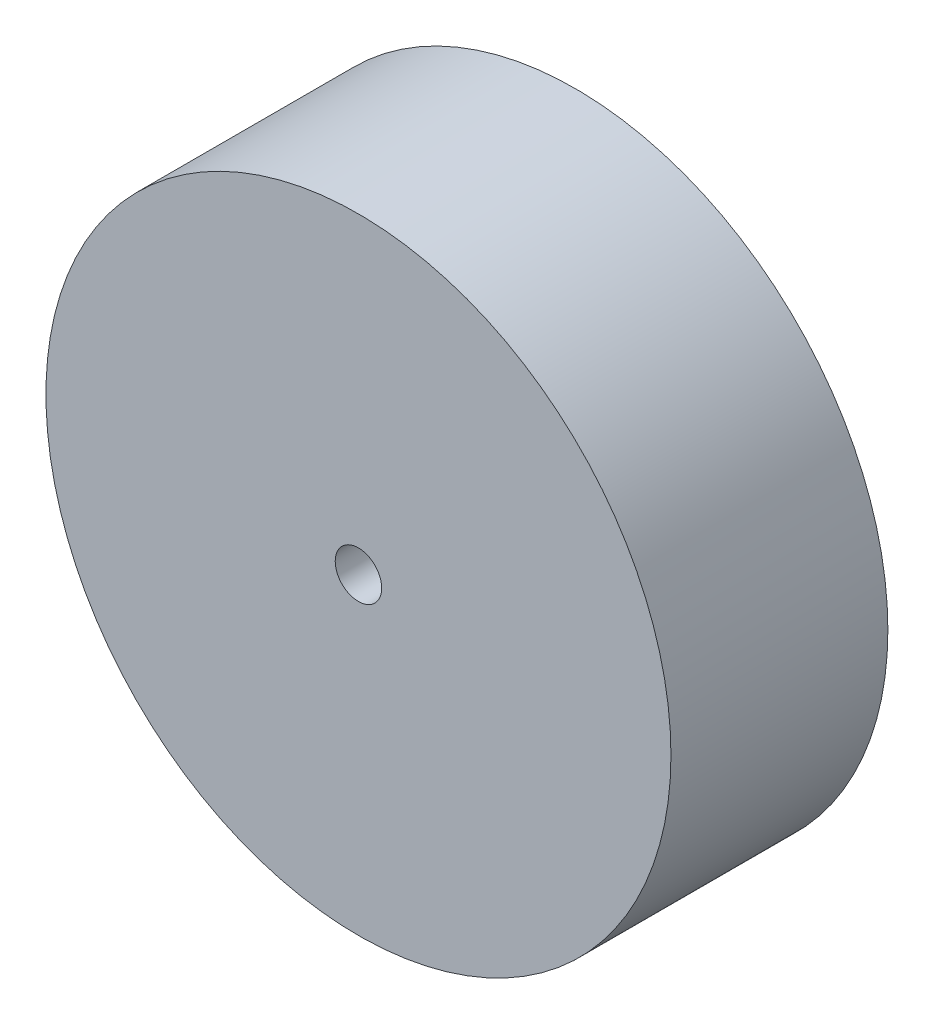
ISO-10303-21;
HEADER;
FILE_DESCRIPTION(('STEP AP214'),'2;1');
FILE_NAME('part.step','',(''),(''),'','','');
FILE_SCHEMA(('AUTOMOTIVE_DESIGN { 1 0 10303 214 1 1 1 1 }'));
ENDSEC;
DATA;
#1=APPLICATION_CONTEXT('core data for automotive mechanical design processes');
#2=APPLICATION_PROTOCOL_DEFINITION('international standard','automotive_design',2000,#1);
#3=PRODUCT_CONTEXT('',#1,'mechanical');
#4=PRODUCT('Part','Part','',(#3));
#5=PRODUCT_RELATED_PRODUCT_CATEGORY('part','',(#4));
#6=PRODUCT_DEFINITION_FORMATION('','',#4);
#7=PRODUCT_DEFINITION_CONTEXT('part definition',#1,'design');
#8=PRODUCT_DEFINITION('design','',#6,#7);
#9=PRODUCT_DEFINITION_SHAPE('','',#8);
#10=(LENGTH_UNIT() NAMED_UNIT(*) SI_UNIT(.MILLI.,.METRE.));
#11=(NAMED_UNIT(*) PLANE_ANGLE_UNIT() SI_UNIT($,.RADIAN.));
#12=(NAMED_UNIT(*) SI_UNIT($,.STERADIAN.) SOLID_ANGLE_UNIT());
#13=UNCERTAINTY_MEASURE_WITH_UNIT(LENGTH_MEASURE(1.E-05),#10,'distance_accuracy_value','');
#14=(GEOMETRIC_REPRESENTATION_CONTEXT(3) GLOBAL_UNCERTAINTY_ASSIGNED_CONTEXT((#13)) GLOBAL_UNIT_ASSIGNED_CONTEXT((#10,
#11,#12)) REPRESENTATION_CONTEXT('',''));
#15=CARTESIAN_POINT('',(0.,0.,0.));
#16=DIRECTION('',(0.,0.,1.));
#17=DIRECTION('',(1.,0.,0.));
#18=AXIS2_PLACEMENT_3D('',#15,#16,#17);
#19=CARTESIAN_POINT('',(125.,-135.,-9.6));
#20=DIRECTION('',(0.,0.,-1.));
#21=DIRECTION('',(-1.,0.,0.));
#22=AXIS2_PLACEMENT_3D('',#19,#20,#21);
#23=CYLINDRICAL_SURFACE('',#22,1.11499999999999);
#24=CARTESIAN_POINT('',(125.,-135.,-11.7622537867961));
#25=DIRECTION('',(0.,0.,-1.));
#26=DIRECTION('',(-1.,0.,0.));
#27=AXIS2_PLACEMENT_3D('',#24,#25,#26);
#28=CIRCLE('',#27,1.11499999999999);
#29=CARTESIAN_POINT('',(123.885,-135.,-11.7622537867961));
#30=VERTEX_POINT('',#29);
#31=EDGE_CURVE('E27',#30,#30,#28,.T.);
#32=ORIENTED_EDGE('',*,*,#31,.T.);
#33=EDGE_LOOP('',(#32));
#34=FACE_BOUND('',#33,.T.);
#35=CARTESIAN_POINT('',(125.,-135.,-1.35));
#36=DIRECTION('',(0.,0.,-1.));
#37=DIRECTION('',(-1.,0.,0.));
#38=AXIS2_PLACEMENT_3D('',#35,#36,#37);
#39=CIRCLE('',#38,1.11499999999999);
#40=CARTESIAN_POINT('',(123.885,-135.,-1.35));
#41=VERTEX_POINT('',#40);
#42=EDGE_CURVE('E18',#41,#41,#39,.T.);
#43=ORIENTED_EDGE('',*,*,#42,.F.);
#44=EDGE_LOOP('',(#43));
#45=FACE_BOUND('',#44,.T.);
#46=ADVANCED_FACE('F15',(#34,#45),#23,.F.);
#47=CARTESIAN_POINT('',(124.99956541284,-135.008142587791,-1.35));
#48=DIRECTION('',(0.,0.,1.));
#49=DIRECTION('',(1.,0.,0.));
#50=AXIS2_PLACEMENT_3D('',#47,#48,#49);
#51=PLANE('',#50);
#52=ORIENTED_EDGE('',*,*,#42,.T.);
#53=EDGE_LOOP('',(#52));
#54=FACE_BOUND('',#53,.T.);
#55=CARTESIAN_POINT('',(125.,-135.,-1.35));
#56=DIRECTION('',(0.,0.,1.));
#57=DIRECTION('',(1.,0.,0.));
#58=AXIS2_PLACEMENT_3D('',#55,#56,#57);
#59=CIRCLE('',#58,15.0000000000002);
#60=CARTESIAN_POINT('',(140.,-135.,-1.35));
#61=VERTEX_POINT('',#60);
#62=EDGE_CURVE('E22',#61,#61,#59,.F.);
#63=ORIENTED_EDGE('',*,*,#62,.F.);
#64=EDGE_LOOP('',(#63));
#65=FACE_BOUND('',#64,.T.);
#66=ADVANCED_FACE('F35',(#54,#65),#51,.T.);
#67=CARTESIAN_POINT('',(124.99956541284,-135.008142587791,-11.7622537867961));
#68=DIRECTION('',(0.,0.,1.));
#69=DIRECTION('',(1.,0.,0.));
#70=AXIS2_PLACEMENT_3D('',#67,#68,#69);
#71=PLANE('',#70);
#72=ORIENTED_EDGE('',*,*,#31,.F.);
#73=EDGE_LOOP('',(#72));
#74=FACE_BOUND('',#73,.T.);
#75=CARTESIAN_POINT('',(125.,-135.,-11.7622537867961));
#76=DIRECTION('',(0.,0.,1.));
#77=DIRECTION('',(1.,0.,0.));
#78=AXIS2_PLACEMENT_3D('',#75,#76,#77);
#79=CIRCLE('',#78,15.0000000000002);
#80=CARTESIAN_POINT('',(140.,-135.,-11.7622537867961));
#81=VERTEX_POINT('',#80);
#82=EDGE_CURVE('E10',#81,#81,#79,.T.);
#83=ORIENTED_EDGE('',*,*,#82,.F.);
#84=EDGE_LOOP('',(#83));
#85=FACE_BOUND('',#84,.T.);
#86=ADVANCED_FACE('F43',(#74,#85),#71,.F.);
#87=CARTESIAN_POINT('',(125.,-135.,-10.6));
#88=DIRECTION('',(0.,0.,1.));
#89=DIRECTION('',(1.,0.,0.));
#90=AXIS2_PLACEMENT_3D('',#87,#88,#89);
#91=CYLINDRICAL_SURFACE('',#90,15.0000000000002);
#92=ORIENTED_EDGE('',*,*,#62,.T.);
#93=EDGE_LOOP('',(#92));
#94=FACE_BOUND('',#93,.T.);
#95=ORIENTED_EDGE('',*,*,#82,.T.);
#96=EDGE_LOOP('',(#95));
#97=FACE_BOUND('',#96,.T.);
#98=ADVANCED_FACE('F44',(#94,#97),#91,.T.);
#99=CLOSED_SHELL('',(#46,#66,#86,#98));
#100=MANIFOLD_SOLID_BREP('B1',#99);
#101=ADVANCED_BREP_SHAPE_REPRESENTATION('',(#18,#100),#14);
#102=SHAPE_DEFINITION_REPRESENTATION(#9,#101);
ENDSEC;
END-ISO-10303-21;
